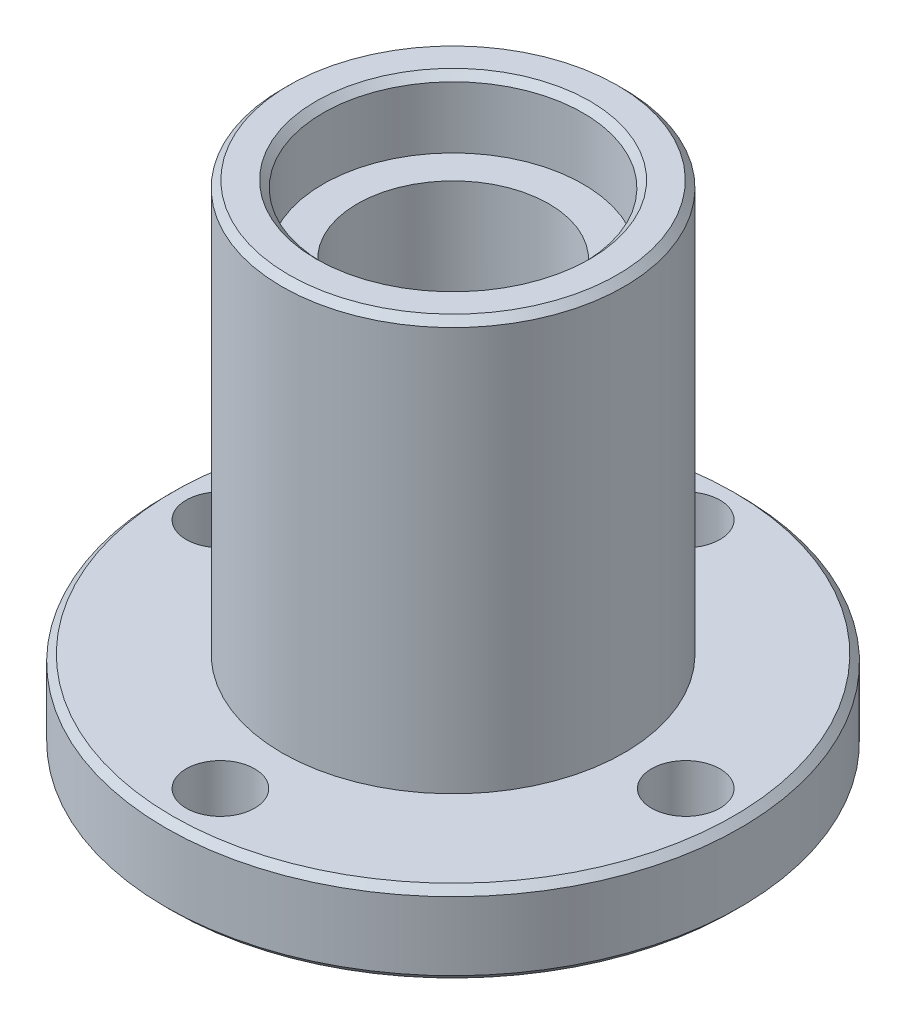
ISO-10303-21;
HEADER;
FILE_DESCRIPTION(('STEP AP214'),'2;1');
FILE_NAME('part.step','',(''),(''),'','','');
FILE_SCHEMA(('AUTOMOTIVE_DESIGN { 1 0 10303 214 1 1 1 1 }'));
ENDSEC;
DATA;
#1=APPLICATION_CONTEXT('core data for automotive mechanical design processes');
#2=APPLICATION_PROTOCOL_DEFINITION('international standard','automotive_design',2000,#1);
#3=PRODUCT_CONTEXT('',#1,'mechanical');
#4=PRODUCT('Part','Part','',(#3));
#5=PRODUCT_RELATED_PRODUCT_CATEGORY('part','',(#4));
#6=PRODUCT_DEFINITION_FORMATION('','',#4);
#7=PRODUCT_DEFINITION_CONTEXT('part definition',#1,'design');
#8=PRODUCT_DEFINITION('design','',#6,#7);
#9=PRODUCT_DEFINITION_SHAPE('','',#8);
#10=(LENGTH_UNIT() NAMED_UNIT(*) SI_UNIT(.MILLI.,.METRE.));
#11=(NAMED_UNIT(*) PLANE_ANGLE_UNIT() SI_UNIT($,.RADIAN.));
#12=(NAMED_UNIT(*) SI_UNIT($,.STERADIAN.) SOLID_ANGLE_UNIT());
#13=UNCERTAINTY_MEASURE_WITH_UNIT(LENGTH_MEASURE(1.E-05),#10,'distance_accuracy_value','');
#14=(GEOMETRIC_REPRESENTATION_CONTEXT(3) GLOBAL_UNCERTAINTY_ASSIGNED_CONTEXT((#13)) GLOBAL_UNIT_ASSIGNED_CONTEXT((#10,
#11,#12)) REPRESENTATION_CONTEXT('',''));
#15=CARTESIAN_POINT('',(0.,0.,0.));
#16=DIRECTION('',(0.,0.,1.));
#17=DIRECTION('',(1.,0.,0.));
#18=AXIS2_PLACEMENT_3D('',#15,#16,#17);
#19=CARTESIAN_POINT('',(0.,35.5,0.));
#20=DIRECTION('',(0.,1.,0.));
#21=DIRECTION('',(0.,0.,1.));
#22=AXIS2_PLACEMENT_3D('',#19,#20,#21);
#23=CONICAL_SURFACE('',#22,9.5,0.785398163397457);
#24=CARTESIAN_POINT('',(0.,35.5,0.));
#25=DIRECTION('',(0.,1.,0.));
#26=DIRECTION('',(0.,0.,1.));
#27=AXIS2_PLACEMENT_3D('',#24,#25,#26);
#28=CIRCLE('',#27,9.5);
#29=CARTESIAN_POINT('',(0.,35.5,9.5));
#30=VERTEX_POINT('',#29);
#31=EDGE_CURVE('E11',#30,#30,#28,.T.);
#32=ORIENTED_EDGE('',*,*,#31,.F.);
#33=EDGE_LOOP('',(#32));
#34=FACE_BOUND('',#33,.T.);
#35=CARTESIAN_POINT('',(0.,36.,0.));
#36=DIRECTION('',(0.,-1.,0.));
#37=DIRECTION('',(0.,0.,1.));
#38=AXIS2_PLACEMENT_3D('',#35,#36,#37);
#39=CIRCLE('',#38,10.);
#40=CARTESIAN_POINT('',(0.,36.,10.));
#41=VERTEX_POINT('',#40);
#42=EDGE_CURVE('E191',#41,#41,#39,.T.);
#43=ORIENTED_EDGE('',*,*,#42,.F.);
#44=EDGE_LOOP('',(#43));
#45=FACE_BOUND('',#44,.T.);
#46=ADVANCED_FACE('F17',(#34,#45),#23,.F.);
#47=CARTESIAN_POINT('',(0.,0.5,0.));
#48=DIRECTION('',(0.,-1.,0.));
#49=DIRECTION('',(0.,0.,-1.));
#50=AXIS2_PLACEMENT_3D('',#47,#48,#49);
#51=CONICAL_SURFACE('',#50,9.5,0.78539816339745);
#52=CARTESIAN_POINT('',(0.,0.5,0.));
#53=DIRECTION('',(0.,-1.,0.));
#54=DIRECTION('',(0.,0.,1.));
#55=AXIS2_PLACEMENT_3D('',#52,#53,#54);
#56=CIRCLE('',#55,9.5);
#57=CARTESIAN_POINT('',(0.,0.5,9.5));
#58=VERTEX_POINT('',#57);
#59=EDGE_CURVE('E194',#58,#58,#56,.T.);
#60=ORIENTED_EDGE('',*,*,#59,.F.);
#61=EDGE_LOOP('',(#60));
#62=FACE_BOUND('',#61,.T.);
#63=CARTESIAN_POINT('',(0.,0.,0.));
#64=DIRECTION('',(0.,1.,0.));
#65=DIRECTION('',(0.,0.,1.));
#66=AXIS2_PLACEMENT_3D('',#63,#64,#65);
#67=CIRCLE('',#66,10.);
#68=CARTESIAN_POINT('',(0.,0.,10.));
#69=VERTEX_POINT('',#68);
#70=EDGE_CURVE('E160',#69,#69,#67,.T.);
#71=ORIENTED_EDGE('',*,*,#70,.F.);
#72=EDGE_LOOP('',(#71));
#73=FACE_BOUND('',#72,.T.);
#74=ADVANCED_FACE('F464',(#62,#73),#51,.F.);
#75=CARTESIAN_POINT('',(0.,36.,0.));
#76=DIRECTION('',(0.,-1.,0.));
#77=DIRECTION('',(0.,0.,-1.));
#78=AXIS2_PLACEMENT_3D('',#75,#76,#77);
#79=CONICAL_SURFACE('',#78,12.,0.785398163397445);
#80=CARTESIAN_POINT('',(0.,36.,0.));
#81=DIRECTION('',(0.,1.,0.));
#82=DIRECTION('',(0.,0.,1.));
#83=AXIS2_PLACEMENT_3D('',#80,#81,#82);
#84=CIRCLE('',#83,12.);
#85=CARTESIAN_POINT('',(0.,36.,12.));
#86=VERTEX_POINT('',#85);
#87=EDGE_CURVE('E188',#86,#86,#84,.T.);
#88=ORIENTED_EDGE('',*,*,#87,.F.);
#89=EDGE_LOOP('',(#88));
#90=FACE_BOUND('',#89,.T.);
#91=CARTESIAN_POINT('',(0.,35.5,0.));
#92=DIRECTION('',(0.,-1.,0.));
#93=DIRECTION('',(0.,0.,1.));
#94=AXIS2_PLACEMENT_3D('',#91,#92,#93);
#95=CIRCLE('',#94,12.5);
#96=CARTESIAN_POINT('',(0.,35.5,12.5));
#97=VERTEX_POINT('',#96);
#98=EDGE_CURVE('E180',#97,#97,#95,.T.);
#99=ORIENTED_EDGE('',*,*,#98,.F.);
#100=EDGE_LOOP('',(#99));
#101=FACE_BOUND('',#100,.T.);
#102=ADVANCED_FACE('F433',(#90,#101),#79,.T.);
#103=CARTESIAN_POINT('',(0.,6.,0.));
#104=DIRECTION('',(0.,-1.,0.));
#105=DIRECTION('',(0.,0.,-1.));
#106=AXIS2_PLACEMENT_3D('',#103,#104,#105);
#107=CONICAL_SURFACE('',#106,20.5,0.785398163397455);
#108=CARTESIAN_POINT('',(0.,6.,0.));
#109=DIRECTION('',(0.,1.,0.));
#110=DIRECTION('',(0.,0.,1.));
#111=AXIS2_PLACEMENT_3D('',#108,#109,#110);
#112=CIRCLE('',#111,20.5);
#113=CARTESIAN_POINT('',(0.,6.,20.5));
#114=VERTEX_POINT('',#113);
#115=EDGE_CURVE('E157',#114,#114,#112,.T.);
#116=ORIENTED_EDGE('',*,*,#115,.F.);
#117=EDGE_LOOP('',(#116));
#118=FACE_BOUND('',#117,.T.);
#119=CARTESIAN_POINT('',(0.,5.5,0.));
#120=DIRECTION('',(0.,-1.,0.));
#121=DIRECTION('',(0.,0.,1.));
#122=AXIS2_PLACEMENT_3D('',#119,#120,#121);
#123=CIRCLE('',#122,21.);
#124=CARTESIAN_POINT('',(0.,5.5,21.));
#125=VERTEX_POINT('',#124);
#126=EDGE_CURVE('E139',#125,#125,#123,.T.);
#127=ORIENTED_EDGE('',*,*,#126,.F.);
#128=EDGE_LOOP('',(#127));
#129=FACE_BOUND('',#128,.T.);
#130=ADVANCED_FACE('F363',(#118,#129),#107,.T.);
#131=CARTESIAN_POINT('',(0.,0.5,0.));
#132=DIRECTION('',(0.,1.,0.));
#133=DIRECTION('',(0.,0.,1.));
#134=AXIS2_PLACEMENT_3D('',#131,#132,#133);
#135=CONICAL_SURFACE('',#134,21.,0.785398163397445);
#136=CARTESIAN_POINT('',(0.,0.,0.));
#137=DIRECTION('',(0.,-1.,0.));
#138=DIRECTION('',(0.,0.,1.));
#139=AXIS2_PLACEMENT_3D('',#136,#137,#138);
#140=CIRCLE('',#139,20.5);
#141=CARTESIAN_POINT('',(0.,0.,20.5));
#142=VERTEX_POINT('',#141);
#143=EDGE_CURVE('E147',#142,#142,#140,.T.);
#144=ORIENTED_EDGE('',*,*,#143,.F.);
#145=EDGE_LOOP('',(#144));
#146=FACE_BOUND('',#145,.T.);
#147=CARTESIAN_POINT('',(0.,0.5,0.));
#148=DIRECTION('',(0.,1.,0.));
#149=DIRECTION('',(0.,0.,1.));
#150=AXIS2_PLACEMENT_3D('',#147,#148,#149);
#151=CIRCLE('',#150,21.);
#152=CARTESIAN_POINT('',(0.,0.5,21.));
#153=VERTEX_POINT('',#152);
#154=EDGE_CURVE('E151',#153,#153,#151,.T.);
#155=ORIENTED_EDGE('',*,*,#154,.F.);
#156=EDGE_LOOP('',(#155));
#157=FACE_BOUND('',#156,.T.);
#158=ADVANCED_FACE('F358',(#146,#157),#135,.T.);
#159=CARTESIAN_POINT('',(0.,31.,0.));
#160=DIRECTION('',(0.,1.,0.));
#161=DIRECTION('',(0.,0.,1.));
#162=AXIS2_PLACEMENT_3D('',#159,#160,#161);
#163=CYLINDRICAL_SURFACE('',#162,9.5);
#164=ORIENTED_EDGE('',*,*,#31,.T.);
#165=EDGE_LOOP('',(#164));
#166=FACE_BOUND('',#165,.T.);
#167=CARTESIAN_POINT('',(0.,31.,0.));
#168=DIRECTION('',(0.,1.,0.));
#169=DIRECTION('',(0.,0.,1.));
#170=AXIS2_PLACEMENT_3D('',#167,#168,#169);
#171=CIRCLE('',#170,9.5);
#172=CARTESIAN_POINT('',(0.,31.,9.5));
#173=VERTEX_POINT('',#172);
#174=EDGE_CURVE('E25',#173,#173,#171,.T.);
#175=ORIENTED_EDGE('',*,*,#174,.F.);
#176=EDGE_LOOP('',(#175));
#177=FACE_BOUND('',#176,.T.);
#178=ADVANCED_FACE('F362',(#166,#177),#163,.F.);
#179=CARTESIAN_POINT('',(0.,31.,0.));
#180=DIRECTION('',(0.,1.,0.));
#181=DIRECTION('',(1.,0.,0.));
#182=AXIS2_PLACEMENT_3D('',#179,#180,#181);
#183=PLANE('',#182);
#184=CARTESIAN_POINT('',(0.,31.,0.));
#185=DIRECTION('',(0.,-1.,0.));
#186=DIRECTION('',(0.,0.,1.));
#187=AXIS2_PLACEMENT_3D('',#184,#185,#186);
#188=CIRCLE('',#187,7.);
#189=CARTESIAN_POINT('',(0.,31.,7.));
#190=VERTEX_POINT('',#189);
#191=EDGE_CURVE('E129',#190,#190,#188,.T.);
#192=ORIENTED_EDGE('',*,*,#191,.T.);
#193=EDGE_LOOP('',(#192));
#194=FACE_BOUND('',#193,.T.);
#195=ORIENTED_EDGE('',*,*,#174,.T.);
#196=EDGE_LOOP('',(#195));
#197=FACE_BOUND('',#196,.T.);
#198=ADVANCED_FACE('F130',(#194,#197),#183,.T.);
#199=CARTESIAN_POINT('',(0.,0.,0.));
#200=DIRECTION('',(0.,-1.,0.));
#201=DIRECTION('',(0.,0.,-1.));
#202=AXIS2_PLACEMENT_3D('',#199,#200,#201);
#203=CYLINDRICAL_SURFACE('',#202,9.5);
#204=ORIENTED_EDGE('',*,*,#59,.T.);
#205=EDGE_LOOP('',(#204));
#206=FACE_BOUND('',#205,.T.);
#207=CARTESIAN_POINT('',(0.,5.,0.));
#208=DIRECTION('',(0.,-1.,0.));
#209=DIRECTION('',(0.,0.,-1.));
#210=AXIS2_PLACEMENT_3D('',#207,#208,#209);
#211=CIRCLE('',#210,9.5);
#212=CARTESIAN_POINT('',(0.,5.,-9.5));
#213=VERTEX_POINT('',#212);
#214=EDGE_CURVE('E142',#213,#213,#211,.T.);
#215=ORIENTED_EDGE('',*,*,#214,.F.);
#216=EDGE_LOOP('',(#215));
#217=FACE_BOUND('',#216,.T.);
#218=ADVANCED_FACE('F325',(#206,#217),#203,.F.);
#219=CARTESIAN_POINT('',(7.,5.,0.));
#220=DIRECTION('',(0.,1.,0.));
#221=DIRECTION('',(1.,0.,0.));
#222=AXIS2_PLACEMENT_3D('',#219,#220,#221);
#223=PLANE('',#222);
#224=CARTESIAN_POINT('',(0.,5.,0.));
#225=DIRECTION('',(0.,-1.,0.));
#226=DIRECTION('',(0.,0.,-1.));
#227=AXIS2_PLACEMENT_3D('',#224,#225,#226);
#228=CIRCLE('',#227,7.);
#229=CARTESIAN_POINT('',(0.,5.,-7.));
#230=VERTEX_POINT('',#229);
#231=EDGE_CURVE('E133',#230,#230,#228,.T.);
#232=ORIENTED_EDGE('',*,*,#231,.F.);
#233=EDGE_LOOP('',(#232));
#234=FACE_BOUND('',#233,.T.);
#235=ORIENTED_EDGE('',*,*,#214,.T.);
#236=EDGE_LOOP('',(#235));
#237=FACE_BOUND('',#236,.T.);
#238=ADVANCED_FACE('F320',(#234,#237),#223,.F.);
#239=CARTESIAN_POINT('',(0.,36.,0.));
#240=DIRECTION('',(0.,1.,0.));
#241=DIRECTION('',(1.,0.,0.));
#242=AXIS2_PLACEMENT_3D('',#239,#240,#241);
#243=PLANE('',#242);
#244=ORIENTED_EDGE('',*,*,#42,.T.);
#245=EDGE_LOOP('',(#244));
#246=FACE_BOUND('',#245,.T.);
#247=ORIENTED_EDGE('',*,*,#87,.T.);
#248=EDGE_LOOP('',(#247));
#249=FACE_BOUND('',#248,.T.);
#250=ADVANCED_FACE('F324',(#246,#249),#243,.T.);
#251=CARTESIAN_POINT('',(0.,36.,0.));
#252=DIRECTION('',(0.,-1.,0.));
#253=DIRECTION('',(0.,0.,-1.));
#254=AXIS2_PLACEMENT_3D('',#251,#252,#253);
#255=CYLINDRICAL_SURFACE('',#254,12.5);
#256=ORIENTED_EDGE('',*,*,#98,.T.);
#257=EDGE_LOOP('',(#256));
#258=FACE_BOUND('',#257,.T.);
#259=CARTESIAN_POINT('',(0.,6.,0.));
#260=DIRECTION('',(0.,1.,0.));
#261=DIRECTION('',(0.,0.,1.));
#262=AXIS2_PLACEMENT_3D('',#259,#260,#261);
#263=CIRCLE('',#262,12.5);
#264=CARTESIAN_POINT('',(0.,6.,12.5));
#265=VERTEX_POINT('',#264);
#266=EDGE_CURVE('E163',#265,#265,#263,.T.);
#267=ORIENTED_EDGE('',*,*,#266,.T.);
#268=EDGE_LOOP('',(#267));
#269=FACE_BOUND('',#268,.T.);
#270=ADVANCED_FACE('F334',(#258,#269),#255,.T.);
#271=CARTESIAN_POINT('',(-17.,0.,0.));
#272=DIRECTION('',(0.,1.,0.));
#273=DIRECTION('',(0.,0.,1.));
#274=AXIS2_PLACEMENT_3D('',#271,#272,#273);
#275=CYLINDRICAL_SURFACE('',#274,2.5);
#276=CARTESIAN_POINT('',(-17.,0.,0.));
#277=DIRECTION('',(0.,1.,0.));
#278=DIRECTION('',(1.,0.,0.));
#279=AXIS2_PLACEMENT_3D('',#276,#277,#278);
#280=CIRCLE('',#279,2.5);
#281=CARTESIAN_POINT('',(-14.5,0.,0.));
#282=VERTEX_POINT('',#281);
#283=EDGE_CURVE('E167',#282,#282,#280,.T.);
#284=ORIENTED_EDGE('',*,*,#283,.F.);
#285=EDGE_LOOP('',(#284));
#286=FACE_BOUND('',#285,.T.);
#287=CARTESIAN_POINT('',(-17.,6.,0.));
#288=DIRECTION('',(0.,1.,0.));
#289=DIRECTION('',(1.,0.,0.));
#290=AXIS2_PLACEMENT_3D('',#287,#288,#289);
#291=CIRCLE('',#290,2.5);
#292=CARTESIAN_POINT('',(-14.5,6.,0.));
#293=VERTEX_POINT('',#292);
#294=EDGE_CURVE('E166',#293,#293,#291,.T.);
#295=ORIENTED_EDGE('',*,*,#294,.T.);
#296=EDGE_LOOP('',(#295));
#297=FACE_BOUND('',#296,.T.);
#298=ADVANCED_FACE('F382',(#286,#297),#275,.F.);
#299=CARTESIAN_POINT('',(0.,0.,17.));
#300=DIRECTION('',(0.,1.,0.));
#301=DIRECTION('',(0.,0.,1.));
#302=AXIS2_PLACEMENT_3D('',#299,#300,#301);
#303=CYLINDRICAL_SURFACE('',#302,2.5);
#304=CARTESIAN_POINT('',(0.,0.,17.));
#305=DIRECTION('',(0.,1.,0.));
#306=DIRECTION('',(0.,0.,-1.));
#307=AXIS2_PLACEMENT_3D('',#304,#305,#306);
#308=CIRCLE('',#307,2.5);
#309=CARTESIAN_POINT('',(0.,0.,14.5));
#310=VERTEX_POINT('',#309);
#311=EDGE_CURVE('E170',#310,#310,#308,.T.);
#312=ORIENTED_EDGE('',*,*,#311,.F.);
#313=EDGE_LOOP('',(#312));
#314=FACE_BOUND('',#313,.T.);
#315=CARTESIAN_POINT('',(0.,6.,17.));
#316=DIRECTION('',(0.,1.,0.));
#317=DIRECTION('',(0.,0.,-1.));
#318=AXIS2_PLACEMENT_3D('',#315,#316,#317);
#319=CIRCLE('',#318,2.5);
#320=CARTESIAN_POINT('',(0.,6.,14.5));
#321=VERTEX_POINT('',#320);
#322=EDGE_CURVE('E154',#321,#321,#319,.T.);
#323=ORIENTED_EDGE('',*,*,#322,.T.);
#324=EDGE_LOOP('',(#323));
#325=FACE_BOUND('',#324,.T.);
#326=ADVANCED_FACE('F377',(#314,#325),#303,.F.);
#327=CARTESIAN_POINT('',(17.,0.,-1.78065548281E-13));
#328=DIRECTION('',(0.,1.,0.));
#329=DIRECTION('',(0.,0.,1.));
#330=AXIS2_PLACEMENT_3D('',#327,#328,#329);
#331=CYLINDRICAL_SURFACE('',#330,2.5);
#332=CARTESIAN_POINT('',(17.,0.,-1.78065548281E-13));
#333=DIRECTION('',(0.,1.,0.));
#334=DIRECTION('',(-1.,0.,0.));
#335=AXIS2_PLACEMENT_3D('',#332,#333,#334);
#336=CIRCLE('',#335,2.5);
#337=CARTESIAN_POINT('',(14.5,0.,-1.51879438239676E-13));
#338=VERTEX_POINT('',#337);
#339=EDGE_CURVE('E181',#338,#338,#336,.T.);
#340=ORIENTED_EDGE('',*,*,#339,.F.);
#341=EDGE_LOOP('',(#340));
#342=FACE_BOUND('',#341,.T.);
#343=CARTESIAN_POINT('',(17.,6.,-1.78065548281E-13));
#344=DIRECTION('',(0.,1.,0.));
#345=DIRECTION('',(-1.,0.,0.));
#346=AXIS2_PLACEMENT_3D('',#343,#344,#345);
#347=CIRCLE('',#346,2.5);
#348=CARTESIAN_POINT('',(14.5,6.,-1.51879438239676E-13));
#349=VERTEX_POINT('',#348);
#350=EDGE_CURVE('E148',#349,#349,#347,.T.);
#351=ORIENTED_EDGE('',*,*,#350,.T.);
#352=EDGE_LOOP('',(#351));
#353=FACE_BOUND('',#352,.T.);
#354=ADVANCED_FACE('F381',(#342,#353),#331,.F.);
#355=CARTESIAN_POINT('',(0.,0.,-17.));
#356=DIRECTION('',(0.,1.,0.));
#357=DIRECTION('',(0.,0.,1.));
#358=AXIS2_PLACEMENT_3D('',#355,#356,#357);
#359=CYLINDRICAL_SURFACE('',#358,2.5);
#360=CARTESIAN_POINT('',(0.,0.,-17.));
#361=DIRECTION('',(0.,1.,0.));
#362=DIRECTION('',(0.,0.,1.));
#363=AXIS2_PLACEMENT_3D('',#360,#361,#362);
#364=CIRCLE('',#363,2.5);
#365=CARTESIAN_POINT('',(0.,0.,-14.5));
#366=VERTEX_POINT('',#365);
#367=EDGE_CURVE('E177',#366,#366,#364,.T.);
#368=ORIENTED_EDGE('',*,*,#367,.F.);
#369=EDGE_LOOP('',(#368));
#370=FACE_BOUND('',#369,.T.);
#371=CARTESIAN_POINT('',(0.,6.,-17.));
#372=DIRECTION('',(0.,1.,0.));
#373=DIRECTION('',(0.,0.,1.));
#374=AXIS2_PLACEMENT_3D('',#371,#372,#373);
#375=CIRCLE('',#374,2.5);
#376=CARTESIAN_POINT('',(0.,6.,-14.5));
#377=VERTEX_POINT('',#376);
#378=EDGE_CURVE('E144',#377,#377,#375,.T.);
#379=ORIENTED_EDGE('',*,*,#378,.T.);
#380=EDGE_LOOP('',(#379));
#381=FACE_BOUND('',#380,.T.);
#382=ADVANCED_FACE('F397',(#370,#381),#359,.F.);
#383=CARTESIAN_POINT('',(0.,0.,0.));
#384=DIRECTION('',(0.,1.,0.));
#385=DIRECTION('',(1.,0.,0.));
#386=AXIS2_PLACEMENT_3D('',#383,#384,#385);
#387=PLANE('',#386);
#388=ORIENTED_EDGE('',*,*,#367,.T.);
#389=EDGE_LOOP('',(#388));
#390=FACE_BOUND('',#389,.T.);
#391=ORIENTED_EDGE('',*,*,#339,.T.);
#392=EDGE_LOOP('',(#391));
#393=FACE_BOUND('',#392,.T.);
#394=ORIENTED_EDGE('',*,*,#311,.T.);
#395=EDGE_LOOP('',(#394));
#396=FACE_BOUND('',#395,.T.);
#397=ORIENTED_EDGE('',*,*,#283,.T.);
#398=EDGE_LOOP('',(#397));
#399=FACE_BOUND('',#398,.T.);
#400=ORIENTED_EDGE('',*,*,#70,.T.);
#401=EDGE_LOOP('',(#400));
#402=FACE_BOUND('',#401,.T.);
#403=ORIENTED_EDGE('',*,*,#143,.T.);
#404=EDGE_LOOP('',(#403));
#405=FACE_BOUND('',#404,.T.);
#406=ADVANCED_FACE('F391',(#390,#393,#396,#399,#402,#405),#387,.F.);
#407=CARTESIAN_POINT('',(0.,6.,0.));
#408=DIRECTION('',(0.,1.,0.));
#409=DIRECTION('',(1.,0.,0.));
#410=AXIS2_PLACEMENT_3D('',#407,#408,#409);
#411=PLANE('',#410);
#412=ORIENTED_EDGE('',*,*,#378,.F.);
#413=EDGE_LOOP('',(#412));
#414=FACE_BOUND('',#413,.T.);
#415=ORIENTED_EDGE('',*,*,#350,.F.);
#416=EDGE_LOOP('',(#415));
#417=FACE_BOUND('',#416,.T.);
#418=ORIENTED_EDGE('',*,*,#322,.F.);
#419=EDGE_LOOP('',(#418));
#420=FACE_BOUND('',#419,.T.);
#421=ORIENTED_EDGE('',*,*,#294,.F.);
#422=EDGE_LOOP('',(#421));
#423=FACE_BOUND('',#422,.T.);
#424=ORIENTED_EDGE('',*,*,#266,.F.);
#425=EDGE_LOOP('',(#424));
#426=FACE_BOUND('',#425,.T.);
#427=ORIENTED_EDGE('',*,*,#115,.T.);
#428=EDGE_LOOP('',(#427));
#429=FACE_BOUND('',#428,.T.);
#430=ADVANCED_FACE('F352',(#414,#417,#420,#423,#426,#429),#411,.T.);
#431=CARTESIAN_POINT('',(0.,6.,0.));
#432=DIRECTION('',(0.,-1.,0.));
#433=DIRECTION('',(0.,0.,-1.));
#434=AXIS2_PLACEMENT_3D('',#431,#432,#433);
#435=CYLINDRICAL_SURFACE('',#434,21.);
#436=ORIENTED_EDGE('',*,*,#154,.T.);
#437=EDGE_LOOP('',(#436));
#438=FACE_BOUND('',#437,.T.);
#439=ORIENTED_EDGE('',*,*,#126,.T.);
#440=EDGE_LOOP('',(#439));
#441=FACE_BOUND('',#440,.T.);
#442=ADVANCED_FACE('F344',(#438,#441),#435,.T.);
#443=CARTESIAN_POINT('',(0.,0.,0.));
#444=DIRECTION('',(0.,-1.,0.));
#445=DIRECTION('',(0.,0.,-1.));
#446=AXIS2_PLACEMENT_3D('',#443,#444,#445);
#447=CYLINDRICAL_SURFACE('',#446,7.);
#448=ORIENTED_EDGE('',*,*,#231,.T.);
#449=EDGE_LOOP('',(#448));
#450=FACE_BOUND('',#449,.T.);
#451=ORIENTED_EDGE('',*,*,#191,.F.);
#452=EDGE_LOOP('',(#451));
#453=FACE_BOUND('',#452,.T.);
#454=ADVANCED_FACE('F340',(#450,#453),#447,.F.);
#455=CLOSED_SHELL('',(#46,#74,#102,#130,#158,#178,#198,#218,#238,#250,#270,#298,#326,#354,#382,
#406,#430,#442,#454));
#456=MANIFOLD_SOLID_BREP('B1',#455);
#457=ADVANCED_BREP_SHAPE_REPRESENTATION('',(#18,#456),#14);
#458=SHAPE_DEFINITION_REPRESENTATION(#9,#457);
ENDSEC;
END-ISO-10303-21;
